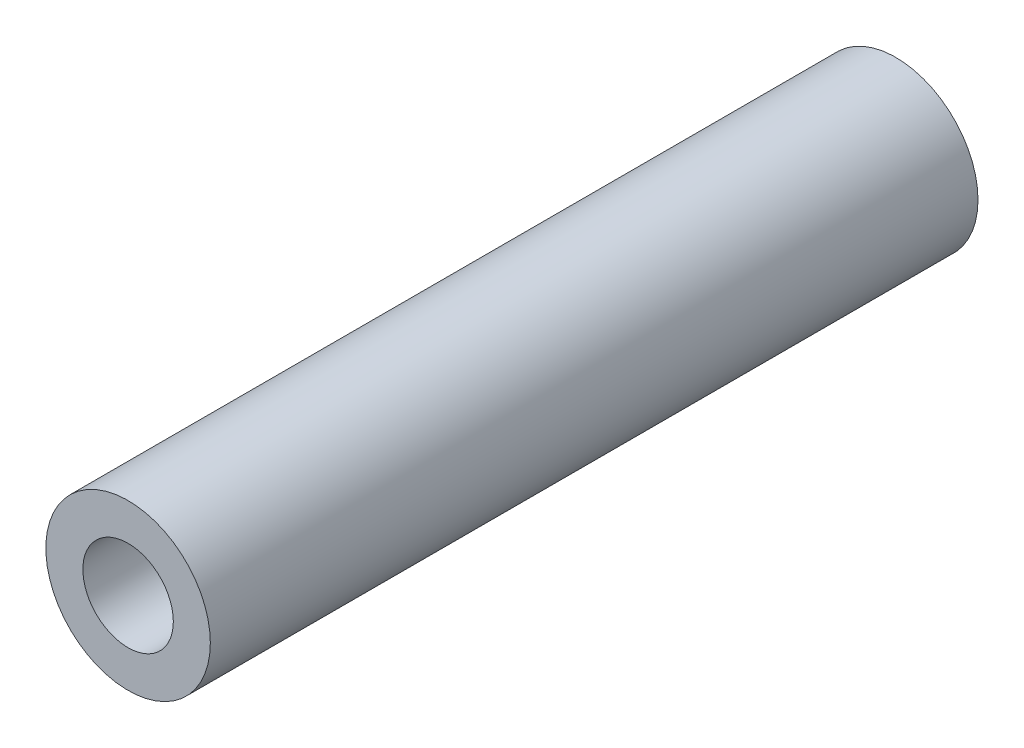
ISO-10303-21;
HEADER;
FILE_DESCRIPTION(('STEP AP214'),'2;1');
FILE_NAME('part.step','',(''),(''),'','','');
FILE_SCHEMA(('AUTOMOTIVE_DESIGN { 1 0 10303 214 1 1 1 1 }'));
ENDSEC;
DATA;
#1=APPLICATION_CONTEXT('core data for automotive mechanical design processes');
#2=APPLICATION_PROTOCOL_DEFINITION('international standard','automotive_design',2000,#1);
#3=PRODUCT_CONTEXT('',#1,'mechanical');
#4=PRODUCT('Part','Part','',(#3));
#5=PRODUCT_RELATED_PRODUCT_CATEGORY('part','',(#4));
#6=PRODUCT_DEFINITION_FORMATION('','',#4);
#7=PRODUCT_DEFINITION_CONTEXT('part definition',#1,'design');
#8=PRODUCT_DEFINITION('design','',#6,#7);
#9=PRODUCT_DEFINITION_SHAPE('','',#8);
#10=(LENGTH_UNIT() NAMED_UNIT(*) SI_UNIT(.MILLI.,.METRE.));
#11=(NAMED_UNIT(*) PLANE_ANGLE_UNIT() SI_UNIT($,.RADIAN.));
#12=(NAMED_UNIT(*) SI_UNIT($,.STERADIAN.) SOLID_ANGLE_UNIT());
#13=UNCERTAINTY_MEASURE_WITH_UNIT(LENGTH_MEASURE(1.E-05),#10,'distance_accuracy_value','');
#14=(GEOMETRIC_REPRESENTATION_CONTEXT(3) GLOBAL_UNCERTAINTY_ASSIGNED_CONTEXT((#13)) GLOBAL_UNIT_ASSIGNED_CONTEXT((#10,
#11,#12)) REPRESENTATION_CONTEXT('',''));
#15=CARTESIAN_POINT('',(0.,0.,0.));
#16=DIRECTION('',(0.,0.,1.));
#17=DIRECTION('',(1.,0.,0.));
#18=AXIS2_PLACEMENT_3D('',#15,#16,#17);
#19=CARTESIAN_POINT('',(0.,0.,140.));
#20=DIRECTION('',(0.,0.,-1.));
#21=DIRECTION('',(-1.,0.,0.));
#22=AXIS2_PLACEMENT_3D('',#19,#20,#21);
#23=PLANE('',#22);
#24=CARTESIAN_POINT('',(0.,0.,140.));
#25=DIRECTION('',(0.,0.,1.));
#26=DIRECTION('',(1.,0.,0.));
#27=AXIS2_PLACEMENT_3D('',#24,#25,#26);
#28=CIRCLE('',#27,15.);
#29=CARTESIAN_POINT('',(15.,0.,140.));
#30=VERTEX_POINT('',#29);
#31=EDGE_CURVE('E10',#30,#30,#28,.T.);
#32=ORIENTED_EDGE('',*,*,#31,.T.);
#33=EDGE_LOOP('',(#32));
#34=FACE_BOUND('',#33,.T.);
#35=CARTESIAN_POINT('',(0.,0.,140.));
#36=DIRECTION('',(0.,0.,1.));
#37=DIRECTION('',(1.,0.,0.));
#38=AXIS2_PLACEMENT_3D('',#35,#36,#37);
#39=CIRCLE('',#38,8.25);
#40=CARTESIAN_POINT('',(8.25,0.,140.));
#41=VERTEX_POINT('',#40);
#42=EDGE_CURVE('E43',#41,#41,#39,.T.);
#43=ORIENTED_EDGE('',*,*,#42,.F.);
#44=EDGE_LOOP('',(#43));
#45=FACE_BOUND('',#44,.T.);
#46=ADVANCED_FACE('F33',(#34,#45),#23,.F.);
#47=CARTESIAN_POINT('',(0.,15.,0.));
#48=DIRECTION('',(0.,0.,1.));
#49=DIRECTION('',(1.,0.,0.));
#50=AXIS2_PLACEMENT_3D('',#47,#48,#49);
#51=PLANE('',#50);
#52=CARTESIAN_POINT('',(0.,0.,0.));
#53=DIRECTION('',(0.,0.,1.));
#54=DIRECTION('',(1.,0.,0.));
#55=AXIS2_PLACEMENT_3D('',#52,#53,#54);
#56=CIRCLE('',#55,15.);
#57=CARTESIAN_POINT('',(15.,0.,0.));
#58=VERTEX_POINT('',#57);
#59=EDGE_CURVE('E39',#58,#58,#56,.T.);
#60=ORIENTED_EDGE('',*,*,#59,.F.);
#61=EDGE_LOOP('',(#60));
#62=FACE_BOUND('',#61,.T.);
#63=CARTESIAN_POINT('',(0.,0.,0.));
#64=DIRECTION('',(0.,0.,1.));
#65=DIRECTION('',(1.,0.,0.));
#66=AXIS2_PLACEMENT_3D('',#63,#64,#65);
#67=CIRCLE('',#66,8.25);
#68=CARTESIAN_POINT('',(8.25,0.,0.));
#69=VERTEX_POINT('',#68);
#70=EDGE_CURVE('E47',#69,#69,#67,.T.);
#71=ORIENTED_EDGE('',*,*,#70,.T.);
#72=EDGE_LOOP('',(#71));
#73=FACE_BOUND('',#72,.T.);
#74=ADVANCED_FACE('F53',(#62,#73),#51,.F.);
#75=CARTESIAN_POINT('',(0.,0.,0.));
#76=DIRECTION('',(0.,0.,1.));
#77=DIRECTION('',(1.,0.,0.));
#78=AXIS2_PLACEMENT_3D('',#75,#76,#77);
#79=CYLINDRICAL_SURFACE('',#78,15.);
#80=ORIENTED_EDGE('',*,*,#31,.F.);
#81=EDGE_LOOP('',(#80));
#82=FACE_BOUND('',#81,.T.);
#83=ORIENTED_EDGE('',*,*,#59,.T.);
#84=EDGE_LOOP('',(#83));
#85=FACE_BOUND('',#84,.T.);
#86=ADVANCED_FACE('F57',(#82,#85),#79,.T.);
#87=CARTESIAN_POINT('',(0.,0.,0.));
#88=DIRECTION('',(0.,0.,1.));
#89=DIRECTION('',(1.,0.,0.));
#90=AXIS2_PLACEMENT_3D('',#87,#88,#89);
#91=CYLINDRICAL_SURFACE('',#90,8.25);
#92=ORIENTED_EDGE('',*,*,#42,.T.);
#93=EDGE_LOOP('',(#92));
#94=FACE_BOUND('',#93,.T.);
#95=ORIENTED_EDGE('',*,*,#70,.F.);
#96=EDGE_LOOP('',(#95));
#97=FACE_BOUND('',#96,.T.);
#98=ADVANCED_FACE('F55',(#94,#97),#91,.F.);
#99=CLOSED_SHELL('',(#46,#74,#86,#98));
#100=MANIFOLD_SOLID_BREP('B2',#99);
#101=ADVANCED_BREP_SHAPE_REPRESENTATION('',(#18,#100),#14);
#102=SHAPE_DEFINITION_REPRESENTATION(#9,#101);
ENDSEC;
END-ISO-10303-21;
